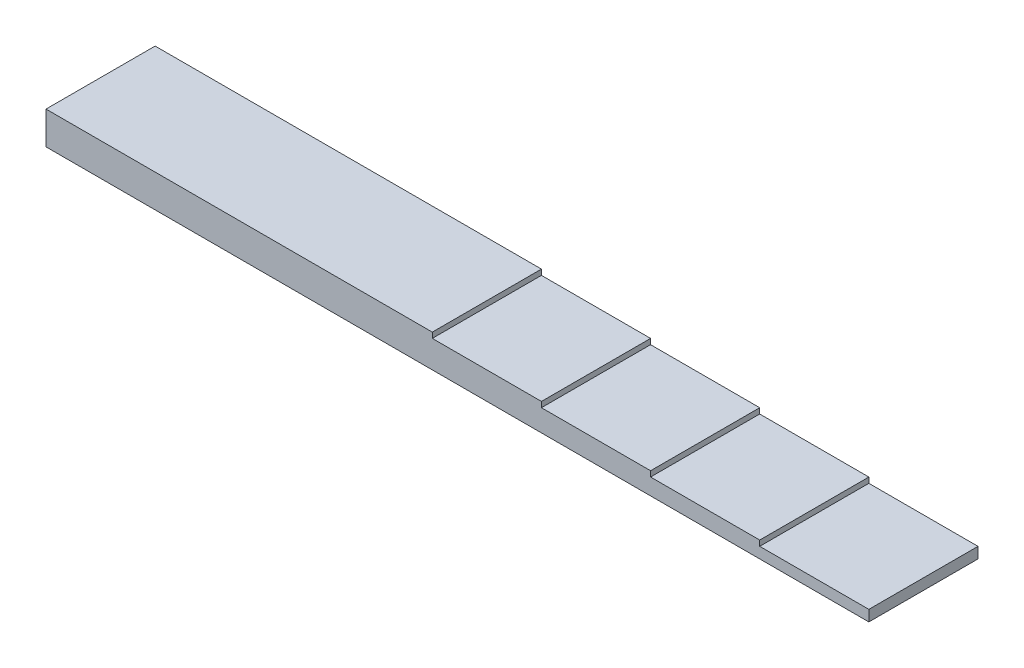
ISO-10303-21;
HEADER;
FILE_DESCRIPTION(('STEP AP214'),'2;1');
FILE_NAME('part.step','',(''),(''),'','','');
FILE_SCHEMA(('AUTOMOTIVE_DESIGN { 1 0 10303 214 1 1 1 1 }'));
ENDSEC;
DATA;
#1=APPLICATION_CONTEXT('core data for automotive mechanical design processes');
#2=APPLICATION_PROTOCOL_DEFINITION('international standard','automotive_design',2000,#1);
#3=PRODUCT_CONTEXT('',#1,'mechanical');
#4=PRODUCT('Part','Part','',(#3));
#5=PRODUCT_RELATED_PRODUCT_CATEGORY('part','',(#4));
#6=PRODUCT_DEFINITION_FORMATION('','',#4);
#7=PRODUCT_DEFINITION_CONTEXT('part definition',#1,'design');
#8=PRODUCT_DEFINITION('design','',#6,#7);
#9=PRODUCT_DEFINITION_SHAPE('','',#8);
#10=(LENGTH_UNIT() NAMED_UNIT(*) SI_UNIT(.MILLI.,.METRE.));
#11=(NAMED_UNIT(*) PLANE_ANGLE_UNIT() SI_UNIT($,.RADIAN.));
#12=(NAMED_UNIT(*) SI_UNIT($,.STERADIAN.) SOLID_ANGLE_UNIT());
#13=UNCERTAINTY_MEASURE_WITH_UNIT(LENGTH_MEASURE(1.E-05),#10,'distance_accuracy_value','');
#14=(GEOMETRIC_REPRESENTATION_CONTEXT(3) GLOBAL_UNCERTAINTY_ASSIGNED_CONTEXT((#13)) GLOBAL_UNIT_ASSIGNED_CONTEXT((#10,
#11,#12)) REPRESENTATION_CONTEXT('',''));
#15=CARTESIAN_POINT('',(0.,0.,0.));
#16=DIRECTION('',(0.,0.,1.));
#17=DIRECTION('',(1.,0.,0.));
#18=AXIS2_PLACEMENT_3D('',#15,#16,#17);
#19=CARTESIAN_POINT('',(2.28847399282888,-15.3024998035555,10.));
#20=DIRECTION('',(-1.,0.,0.));
#21=DIRECTION('',(0.,-1.,0.));
#22=AXIS2_PLACEMENT_3D('',#19,#20,#21);
#23=PLANE('',#22);
#24=DIRECTION('',(0.,1.,0.));
#25=VECTOR('',#24,1.);
#26=CARTESIAN_POINT('',(2.28847399282888,-15.3024998035555,0.));
#27=LINE('',#26,#25);
#28=CARTESIAN_POINT('',(2.28847399282888,-15.3024998035555,0.));
#29=VERTEX_POINT('',#28);
#30=CARTESIAN_POINT('',(2.28847399282889,-14.8024998035555,0.));
#31=VERTEX_POINT('',#30);
#32=EDGE_CURVE('E152',#29,#31,#27,.T.);
#33=ORIENTED_EDGE('',*,*,#32,.T.);
#34=DIRECTION('',(0.,0.,-1.));
#35=VECTOR('',#34,1.);
#36=CARTESIAN_POINT('',(2.28847399282889,-14.8024998035555,10.));
#37=LINE('',#36,#35);
#38=CARTESIAN_POINT('',(2.28847399282889,-14.8024998035555,10.));
#39=VERTEX_POINT('',#38);
#40=EDGE_CURVE('E11',#39,#31,#37,.T.);
#41=ORIENTED_EDGE('',*,*,#40,.F.);
#42=DIRECTION('',(0.,1.,0.));
#43=VECTOR('',#42,1.);
#44=CARTESIAN_POINT('',(2.28847399282888,-15.3024998035555,10.));
#45=LINE('',#44,#43);
#46=CARTESIAN_POINT('',(2.28847399282888,-15.3024998035555,10.));
#47=VERTEX_POINT('',#46);
#48=EDGE_CURVE('E175',#47,#39,#45,.T.);
#49=ORIENTED_EDGE('',*,*,#48,.F.);
#50=DIRECTION('',(0.,0.,-1.));
#51=VECTOR('',#50,1.);
#52=CARTESIAN_POINT('',(2.28847399282888,-15.3024998035555,10.));
#53=LINE('',#52,#51);
#54=EDGE_CURVE('E148',#47,#29,#53,.T.);
#55=ORIENTED_EDGE('',*,*,#54,.T.);
#56=EDGE_LOOP('',(#33,#41,#49,#55));
#57=FACE_BOUND('',#56,.T.);
#58=ADVANCED_FACE('F32',(#57),#23,.F.);
#59=CARTESIAN_POINT('',(2.28847399282889,-14.8024998035555,10.));
#60=DIRECTION('',(0.,-1.,0.));
#61=DIRECTION('',(1.,0.,0.));
#62=AXIS2_PLACEMENT_3D('',#59,#60,#61);
#63=PLANE('',#62);
#64=DIRECTION('',(-1.,0.,0.));
#65=VECTOR('',#64,1.);
#66=CARTESIAN_POINT('',(2.28847399282889,-14.8024998035555,0.));
#67=LINE('',#66,#65);
#68=CARTESIAN_POINT('',(-33.1055690535906,-14.8024998035555,0.));
#69=VERTEX_POINT('',#68);
#70=EDGE_CURVE('E155',#31,#69,#67,.T.);
#71=ORIENTED_EDGE('',*,*,#70,.T.);
#72=DIRECTION('',(0.,0.,-1.));
#73=VECTOR('',#72,1.);
#74=CARTESIAN_POINT('',(-33.1055690535906,-14.8024998035555,10.));
#75=LINE('',#74,#73);
#76=CARTESIAN_POINT('',(-33.1055690535906,-14.8024998035555,10.));
#77=VERTEX_POINT('',#76);
#78=EDGE_CURVE('E40',#77,#69,#75,.T.);
#79=ORIENTED_EDGE('',*,*,#78,.F.);
#80=DIRECTION('',(-1.,0.,0.));
#81=VECTOR('',#80,1.);
#82=CARTESIAN_POINT('',(2.28847399282889,-14.8024998035555,10.));
#83=LINE('',#82,#81);
#84=EDGE_CURVE('E103',#39,#77,#83,.T.);
#85=ORIENTED_EDGE('',*,*,#84,.F.);
#86=ORIENTED_EDGE('',*,*,#40,.T.);
#87=EDGE_LOOP('',(#71,#79,#85,#86));
#88=FACE_BOUND('',#87,.T.);
#89=ADVANCED_FACE('F252',(#88),#63,.F.);
#90=CARTESIAN_POINT('',(-33.1055690535906,-17.8024998035555,10.));
#91=DIRECTION('',(1.,0.,0.));
#92=DIRECTION('',(0.,0.,-1.));
#93=AXIS2_PLACEMENT_3D('',#90,#91,#92);
#94=PLANE('',#93);
#95=DIRECTION('',(0.,-1.,0.));
#96=VECTOR('',#95,1.);
#97=CARTESIAN_POINT('',(-33.1055690535906,-17.8024998035555,0.));
#98=LINE('',#97,#96);
#99=CARTESIAN_POINT('',(-33.1055690535906,-17.8024998035555,0.));
#100=VERTEX_POINT('',#99);
#101=EDGE_CURVE('E157',#69,#100,#98,.T.);
#102=ORIENTED_EDGE('',*,*,#101,.T.);
#103=DIRECTION('',(0.,0.,-1.));
#104=VECTOR('',#103,1.);
#105=CARTESIAN_POINT('',(-33.1055690535906,-17.8024998035555,10.));
#106=LINE('',#105,#104);
#107=CARTESIAN_POINT('',(-33.1055690535906,-17.8024998035555,10.));
#108=VERTEX_POINT('',#107);
#109=EDGE_CURVE('E194',#108,#100,#106,.T.);
#110=ORIENTED_EDGE('',*,*,#109,.F.);
#111=DIRECTION('',(0.,-1.,0.));
#112=VECTOR('',#111,1.);
#113=CARTESIAN_POINT('',(-33.1055690535906,-17.8024998035555,10.));
#114=LINE('',#113,#112);
#115=EDGE_CURVE('E202',#77,#108,#114,.T.);
#116=ORIENTED_EDGE('',*,*,#115,.F.);
#117=ORIENTED_EDGE('',*,*,#78,.T.);
#118=EDGE_LOOP('',(#102,#110,#116,#117));
#119=FACE_BOUND('',#118,.T.);
#120=ADVANCED_FACE('F200',(#119),#94,.F.);
#121=CARTESIAN_POINT('',(32.2884739928289,-17.8024998035555,10.));
#122=DIRECTION('',(0.,1.,0.));
#123=DIRECTION('',(0.,0.,1.));
#124=AXIS2_PLACEMENT_3D('',#121,#122,#123);
#125=PLANE('',#124);
#126=DIRECTION('',(1.,0.,0.));
#127=VECTOR('',#126,1.);
#128=CARTESIAN_POINT('',(32.2884739928289,-17.8024998035555,0.));
#129=LINE('',#128,#127);
#130=CARTESIAN_POINT('',(42.2884739928289,-17.8024998035555,0.));
#131=VERTEX_POINT('',#130);
#132=EDGE_CURVE('E160',#100,#131,#129,.T.);
#133=ORIENTED_EDGE('',*,*,#132,.T.);
#134=DIRECTION('',(0.,0.,-1.));
#135=VECTOR('',#134,1.);
#136=CARTESIAN_POINT('',(42.2884739928289,-17.8024998035555,10.));
#137=LINE('',#136,#135);
#138=CARTESIAN_POINT('',(42.2884739928289,-17.8024998035555,10.));
#139=VERTEX_POINT('',#138);
#140=EDGE_CURVE('E191',#139,#131,#137,.T.);
#141=ORIENTED_EDGE('',*,*,#140,.F.);
#142=DIRECTION('',(1.,0.,0.));
#143=VECTOR('',#142,1.);
#144=CARTESIAN_POINT('',(2.28847399282889,-17.8024998035555,10.));
#145=LINE('',#144,#143);
#146=EDGE_CURVE('E219',#108,#139,#145,.T.);
#147=ORIENTED_EDGE('',*,*,#146,.F.);
#148=ORIENTED_EDGE('',*,*,#109,.T.);
#149=EDGE_LOOP('',(#133,#141,#147,#148));
#150=FACE_BOUND('',#149,.T.);
#151=ADVANCED_FACE('F210',(#150),#125,.F.);
#152=CARTESIAN_POINT('',(42.2884739928289,-17.8024998035555,10.));
#153=DIRECTION('',(-1.,0.,0.));
#154=DIRECTION('',(0.,0.,1.));
#155=AXIS2_PLACEMENT_3D('',#152,#153,#154);
#156=PLANE('',#155);
#157=DIRECTION('',(0.,1.,0.));
#158=VECTOR('',#157,1.);
#159=CARTESIAN_POINT('',(42.2884739928289,-17.8024998035555,0.));
#160=LINE('',#159,#158);
#161=CARTESIAN_POINT('',(42.2884739928289,-16.8024998035555,0.));
#162=VERTEX_POINT('',#161);
#163=EDGE_CURVE('E162',#131,#162,#160,.T.);
#164=ORIENTED_EDGE('',*,*,#163,.T.);
#165=DIRECTION('',(0.,0.,-1.));
#166=VECTOR('',#165,1.);
#167=CARTESIAN_POINT('',(42.2884739928289,-16.8024998035555,10.));
#168=LINE('',#167,#166);
#169=CARTESIAN_POINT('',(42.2884739928289,-16.8024998035555,10.));
#170=VERTEX_POINT('',#169);
#171=EDGE_CURVE('E188',#170,#162,#168,.T.);
#172=ORIENTED_EDGE('',*,*,#171,.F.);
#173=DIRECTION('',(0.,1.,0.));
#174=VECTOR('',#173,1.);
#175=CARTESIAN_POINT('',(42.2884739928289,-17.8024998035555,10.));
#176=LINE('',#175,#174);
#177=EDGE_CURVE('E216',#139,#170,#176,.T.);
#178=ORIENTED_EDGE('',*,*,#177,.F.);
#179=ORIENTED_EDGE('',*,*,#140,.T.);
#180=EDGE_LOOP('',(#164,#172,#178,#179));
#181=FACE_BOUND('',#180,.T.);
#182=ADVANCED_FACE('F214',(#181),#156,.F.);
#183=CARTESIAN_POINT('',(32.2884739928289,-16.8024998035555,10.));
#184=DIRECTION('',(0.,-1.,0.));
#185=DIRECTION('',(0.,0.,-1.));
#186=AXIS2_PLACEMENT_3D('',#183,#184,#185);
#187=PLANE('',#186);
#188=DIRECTION('',(-1.,0.,0.));
#189=VECTOR('',#188,1.);
#190=CARTESIAN_POINT('',(32.2884739928289,-16.8024998035555,0.));
#191=LINE('',#190,#189);
#192=CARTESIAN_POINT('',(32.2884739928289,-16.8024998035555,0.));
#193=VERTEX_POINT('',#192);
#194=EDGE_CURVE('E164',#162,#193,#191,.T.);
#195=ORIENTED_EDGE('',*,*,#194,.T.);
#196=DIRECTION('',(0.,0.,-1.));
#197=VECTOR('',#196,1.);
#198=CARTESIAN_POINT('',(32.2884739928289,-16.8024998035555,10.));
#199=LINE('',#198,#197);
#200=CARTESIAN_POINT('',(32.2884739928289,-16.8024998035555,10.));
#201=VERTEX_POINT('',#200);
#202=EDGE_CURVE('E185',#201,#193,#199,.T.);
#203=ORIENTED_EDGE('',*,*,#202,.F.);
#204=DIRECTION('',(-1.,0.,0.));
#205=VECTOR('',#204,1.);
#206=CARTESIAN_POINT('',(32.2884739928289,-16.8024998035555,10.));
#207=LINE('',#206,#205);
#208=EDGE_CURVE('E218',#170,#201,#207,.T.);
#209=ORIENTED_EDGE('',*,*,#208,.F.);
#210=ORIENTED_EDGE('',*,*,#171,.T.);
#211=EDGE_LOOP('',(#195,#203,#209,#210));
#212=FACE_BOUND('',#211,.T.);
#213=ADVANCED_FACE('F265',(#212),#187,.F.);
#214=CARTESIAN_POINT('',(32.2884739928289,-16.8024998035555,10.));
#215=DIRECTION('',(-1.,0.,0.));
#216=DIRECTION('',(0.,0.,1.));
#217=AXIS2_PLACEMENT_3D('',#214,#215,#216);
#218=PLANE('',#217);
#219=DIRECTION('',(0.,1.,0.));
#220=VECTOR('',#219,1.);
#221=CARTESIAN_POINT('',(32.2884739928289,-16.8024998035555,0.));
#222=LINE('',#221,#220);
#223=CARTESIAN_POINT('',(32.2884739928289,-16.3024998035555,0.));
#224=VERTEX_POINT('',#223);
#225=EDGE_CURVE('E166',#193,#224,#222,.T.);
#226=ORIENTED_EDGE('',*,*,#225,.T.);
#227=DIRECTION('',(0.,0.,-1.));
#228=VECTOR('',#227,1.);
#229=CARTESIAN_POINT('',(32.2884739928289,-16.3024998035555,10.));
#230=LINE('',#229,#228);
#231=CARTESIAN_POINT('',(32.2884739928289,-16.3024998035555,10.));
#232=VERTEX_POINT('',#231);
#233=EDGE_CURVE('E182',#232,#224,#230,.T.);
#234=ORIENTED_EDGE('',*,*,#233,.F.);
#235=DIRECTION('',(0.,1.,0.));
#236=VECTOR('',#235,1.);
#237=CARTESIAN_POINT('',(32.2884739928289,-16.8024998035555,10.));
#238=LINE('',#237,#236);
#239=EDGE_CURVE('E221',#201,#232,#238,.T.);
#240=ORIENTED_EDGE('',*,*,#239,.F.);
#241=ORIENTED_EDGE('',*,*,#202,.T.);
#242=EDGE_LOOP('',(#226,#234,#240,#241));
#243=FACE_BOUND('',#242,.T.);
#244=ADVANCED_FACE('F268',(#243),#218,.F.);
#245=CARTESIAN_POINT('',(22.2884739928289,-16.3024998035555,10.));
#246=DIRECTION('',(0.,-1.,0.));
#247=DIRECTION('',(0.,0.,-1.));
#248=AXIS2_PLACEMENT_3D('',#245,#246,#247);
#249=PLANE('',#248);
#250=DIRECTION('',(-1.,0.,0.));
#251=VECTOR('',#250,1.);
#252=CARTESIAN_POINT('',(22.2884739928289,-16.3024998035555,0.));
#253=LINE('',#252,#251);
#254=CARTESIAN_POINT('',(22.2884739928289,-16.3024998035555,0.));
#255=VERTEX_POINT('',#254);
#256=EDGE_CURVE('E168',#224,#255,#253,.T.);
#257=ORIENTED_EDGE('',*,*,#256,.T.);
#258=DIRECTION('',(0.,0.,-1.));
#259=VECTOR('',#258,1.);
#260=CARTESIAN_POINT('',(22.2884739928289,-16.3024998035555,10.));
#261=LINE('',#260,#259);
#262=CARTESIAN_POINT('',(22.2884739928289,-16.3024998035555,10.));
#263=VERTEX_POINT('',#262);
#264=EDGE_CURVE('E179',#263,#255,#261,.T.);
#265=ORIENTED_EDGE('',*,*,#264,.F.);
#266=DIRECTION('',(-1.,0.,0.));
#267=VECTOR('',#266,1.);
#268=CARTESIAN_POINT('',(22.2884739928289,-16.3024998035555,10.));
#269=LINE('',#268,#267);
#270=EDGE_CURVE('E227',#232,#263,#269,.T.);
#271=ORIENTED_EDGE('',*,*,#270,.F.);
#272=ORIENTED_EDGE('',*,*,#233,.T.);
#273=EDGE_LOOP('',(#257,#265,#271,#272));
#274=FACE_BOUND('',#273,.T.);
#275=ADVANCED_FACE('F233',(#274),#249,.F.);
#276=CARTESIAN_POINT('',(22.2884739928289,-16.3024998035555,10.));
#277=DIRECTION('',(-1.,0.,0.));
#278=DIRECTION('',(0.,0.,1.));
#279=AXIS2_PLACEMENT_3D('',#276,#277,#278);
#280=PLANE('',#279);
#281=DIRECTION('',(0.,1.,0.));
#282=VECTOR('',#281,1.);
#283=CARTESIAN_POINT('',(22.2884739928289,-16.3024998035555,0.));
#284=LINE('',#283,#282);
#285=CARTESIAN_POINT('',(22.2884739928289,-15.8024998035555,0.));
#286=VERTEX_POINT('',#285);
#287=EDGE_CURVE('E170',#255,#286,#284,.T.);
#288=ORIENTED_EDGE('',*,*,#287,.T.);
#289=DIRECTION('',(0.,0.,-1.));
#290=VECTOR('',#289,1.);
#291=CARTESIAN_POINT('',(22.2884739928289,-15.8024998035555,10.));
#292=LINE('',#291,#290);
#293=CARTESIAN_POINT('',(22.2884739928289,-15.8024998035555,10.));
#294=VERTEX_POINT('',#293);
#295=EDGE_CURVE('E143',#294,#286,#292,.T.);
#296=ORIENTED_EDGE('',*,*,#295,.F.);
#297=DIRECTION('',(0.,1.,0.));
#298=VECTOR('',#297,1.);
#299=CARTESIAN_POINT('',(22.2884739928289,-16.3024998035555,10.));
#300=LINE('',#299,#298);
#301=EDGE_CURVE('E134',#263,#294,#300,.T.);
#302=ORIENTED_EDGE('',*,*,#301,.F.);
#303=ORIENTED_EDGE('',*,*,#264,.T.);
#304=EDGE_LOOP('',(#288,#296,#302,#303));
#305=FACE_BOUND('',#304,.T.);
#306=ADVANCED_FACE('F237',(#305),#280,.F.);
#307=CARTESIAN_POINT('',(12.2884739928289,-15.8024998035555,10.));
#308=DIRECTION('',(0.,-1.,0.));
#309=DIRECTION('',(0.,0.,-1.));
#310=AXIS2_PLACEMENT_3D('',#307,#308,#309);
#311=PLANE('',#310);
#312=DIRECTION('',(-1.,0.,0.));
#313=VECTOR('',#312,1.);
#314=CARTESIAN_POINT('',(12.2884739928289,-15.8024998035555,0.));
#315=LINE('',#314,#313);
#316=CARTESIAN_POINT('',(12.2884739928289,-15.8024998035555,0.));
#317=VERTEX_POINT('',#316);
#318=EDGE_CURVE('E142',#286,#317,#315,.T.);
#319=ORIENTED_EDGE('',*,*,#318,.T.);
#320=DIRECTION('',(0.,0.,-1.));
#321=VECTOR('',#320,1.);
#322=CARTESIAN_POINT('',(12.2884739928289,-15.8024998035555,10.));
#323=LINE('',#322,#321);
#324=CARTESIAN_POINT('',(12.2884739928289,-15.8024998035555,10.));
#325=VERTEX_POINT('',#324);
#326=EDGE_CURVE('E139',#325,#317,#323,.T.);
#327=ORIENTED_EDGE('',*,*,#326,.F.);
#328=DIRECTION('',(-1.,0.,0.));
#329=VECTOR('',#328,1.);
#330=CARTESIAN_POINT('',(12.2884739928289,-15.8024998035555,10.));
#331=LINE('',#330,#329);
#332=EDGE_CURVE('E128',#294,#325,#331,.T.);
#333=ORIENTED_EDGE('',*,*,#332,.F.);
#334=ORIENTED_EDGE('',*,*,#295,.T.);
#335=EDGE_LOOP('',(#319,#327,#333,#334));
#336=FACE_BOUND('',#335,.T.);
#337=ADVANCED_FACE('F140',(#336),#311,.F.);
#338=CARTESIAN_POINT('',(12.2884739928289,-15.3024998035555,10.));
#339=DIRECTION('',(-1.,0.,0.));
#340=DIRECTION('',(0.,0.,1.));
#341=AXIS2_PLACEMENT_3D('',#338,#339,#340);
#342=PLANE('',#341);
#343=DIRECTION('',(0.,1.,0.));
#344=VECTOR('',#343,1.);
#345=CARTESIAN_POINT('',(12.2884739928289,-15.3024998035555,0.));
#346=LINE('',#345,#344);
#347=CARTESIAN_POINT('',(12.2884739928289,-15.3024998035555,0.));
#348=VERTEX_POINT('',#347);
#349=EDGE_CURVE('E89',#317,#348,#346,.T.);
#350=ORIENTED_EDGE('',*,*,#349,.T.);
#351=DIRECTION('',(0.,0.,-1.));
#352=VECTOR('',#351,1.);
#353=CARTESIAN_POINT('',(12.2884739928289,-15.3024998035555,10.));
#354=LINE('',#353,#352);
#355=CARTESIAN_POINT('',(12.2884739928289,-15.3024998035555,10.));
#356=VERTEX_POINT('',#355);
#357=EDGE_CURVE('E144',#356,#348,#354,.T.);
#358=ORIENTED_EDGE('',*,*,#357,.F.);
#359=DIRECTION('',(0.,1.,0.));
#360=VECTOR('',#359,1.);
#361=CARTESIAN_POINT('',(12.2884739928289,-15.3024998035555,10.));
#362=LINE('',#361,#360);
#363=EDGE_CURVE('E132',#325,#356,#362,.T.);
#364=ORIENTED_EDGE('',*,*,#363,.F.);
#365=ORIENTED_EDGE('',*,*,#326,.T.);
#366=EDGE_LOOP('',(#350,#358,#364,#365));
#367=FACE_BOUND('',#366,.T.);
#368=ADVANCED_FACE('F146',(#367),#342,.F.);
#369=CARTESIAN_POINT('',(2.28847399282888,-15.3024998035555,10.));
#370=DIRECTION('',(0.,-1.,0.));
#371=DIRECTION('',(0.,0.,-1.));
#372=AXIS2_PLACEMENT_3D('',#369,#370,#371);
#373=PLANE('',#372);
#374=DIRECTION('',(-1.,0.,0.));
#375=VECTOR('',#374,1.);
#376=CARTESIAN_POINT('',(2.28847399282888,-15.3024998035555,0.));
#377=LINE('',#376,#375);
#378=EDGE_CURVE('E95',#348,#29,#377,.T.);
#379=ORIENTED_EDGE('',*,*,#378,.T.);
#380=ORIENTED_EDGE('',*,*,#54,.F.);
#381=DIRECTION('',(-1.,0.,0.));
#382=VECTOR('',#381,1.);
#383=CARTESIAN_POINT('',(2.28847399282888,-15.3024998035555,10.));
#384=LINE('',#383,#382);
#385=EDGE_CURVE('E48',#356,#47,#384,.T.);
#386=ORIENTED_EDGE('',*,*,#385,.F.);
#387=ORIENTED_EDGE('',*,*,#357,.T.);
#388=EDGE_LOOP('',(#379,#380,#386,#387));
#389=FACE_BOUND('',#388,.T.);
#390=ADVANCED_FACE('F241',(#389),#373,.F.);
#391=CARTESIAN_POINT('',(0.,0.,10.));
#392=DIRECTION('',(0.,0.,1.));
#393=DIRECTION('',(1.,0.,0.));
#394=AXIS2_PLACEMENT_3D('',#391,#392,#393);
#395=PLANE('',#394);
#396=ORIENTED_EDGE('',*,*,#48,.T.);
#397=ORIENTED_EDGE('',*,*,#84,.T.);
#398=ORIENTED_EDGE('',*,*,#115,.T.);
#399=ORIENTED_EDGE('',*,*,#146,.T.);
#400=ORIENTED_EDGE('',*,*,#177,.T.);
#401=ORIENTED_EDGE('',*,*,#208,.T.);
#402=ORIENTED_EDGE('',*,*,#239,.T.);
#403=ORIENTED_EDGE('',*,*,#270,.T.);
#404=ORIENTED_EDGE('',*,*,#301,.T.);
#405=ORIENTED_EDGE('',*,*,#332,.T.);
#406=ORIENTED_EDGE('',*,*,#363,.T.);
#407=ORIENTED_EDGE('',*,*,#385,.T.);
#408=EDGE_LOOP('',(#396,#397,#398,#399,#400,#401,#402,#403,#404,#405,#406,#407));
#409=FACE_BOUND('',#408,.T.);
#410=ADVANCED_FACE('F130',(#409),#395,.T.);
#411=CARTESIAN_POINT('',(0.,0.,0.));
#412=DIRECTION('',(0.,0.,1.));
#413=DIRECTION('',(1.,0.,0.));
#414=AXIS2_PLACEMENT_3D('',#411,#412,#413);
#415=PLANE('',#414);
#416=ORIENTED_EDGE('',*,*,#32,.F.);
#417=ORIENTED_EDGE('',*,*,#378,.F.);
#418=ORIENTED_EDGE('',*,*,#349,.F.);
#419=ORIENTED_EDGE('',*,*,#318,.F.);
#420=ORIENTED_EDGE('',*,*,#287,.F.);
#421=ORIENTED_EDGE('',*,*,#256,.F.);
#422=ORIENTED_EDGE('',*,*,#225,.F.);
#423=ORIENTED_EDGE('',*,*,#194,.F.);
#424=ORIENTED_EDGE('',*,*,#163,.F.);
#425=ORIENTED_EDGE('',*,*,#132,.F.);
#426=ORIENTED_EDGE('',*,*,#101,.F.);
#427=ORIENTED_EDGE('',*,*,#70,.F.);
#428=EDGE_LOOP('',(#416,#417,#418,#419,#420,#421,#422,#423,#424,#425,#426,#427));
#429=FACE_BOUND('',#428,.T.);
#430=ADVANCED_FACE('F205',(#429),#415,.F.);
#431=CLOSED_SHELL('',(#58,#89,#120,#151,#182,#213,#244,#275,#306,#337,#368,#390,#410,#430));
#432=MANIFOLD_SOLID_BREP('B2',#431);
#433=ADVANCED_BREP_SHAPE_REPRESENTATION('',(#18,#432),#14);
#434=SHAPE_DEFINITION_REPRESENTATION(#9,#433);
ENDSEC;
END-ISO-10303-21;
